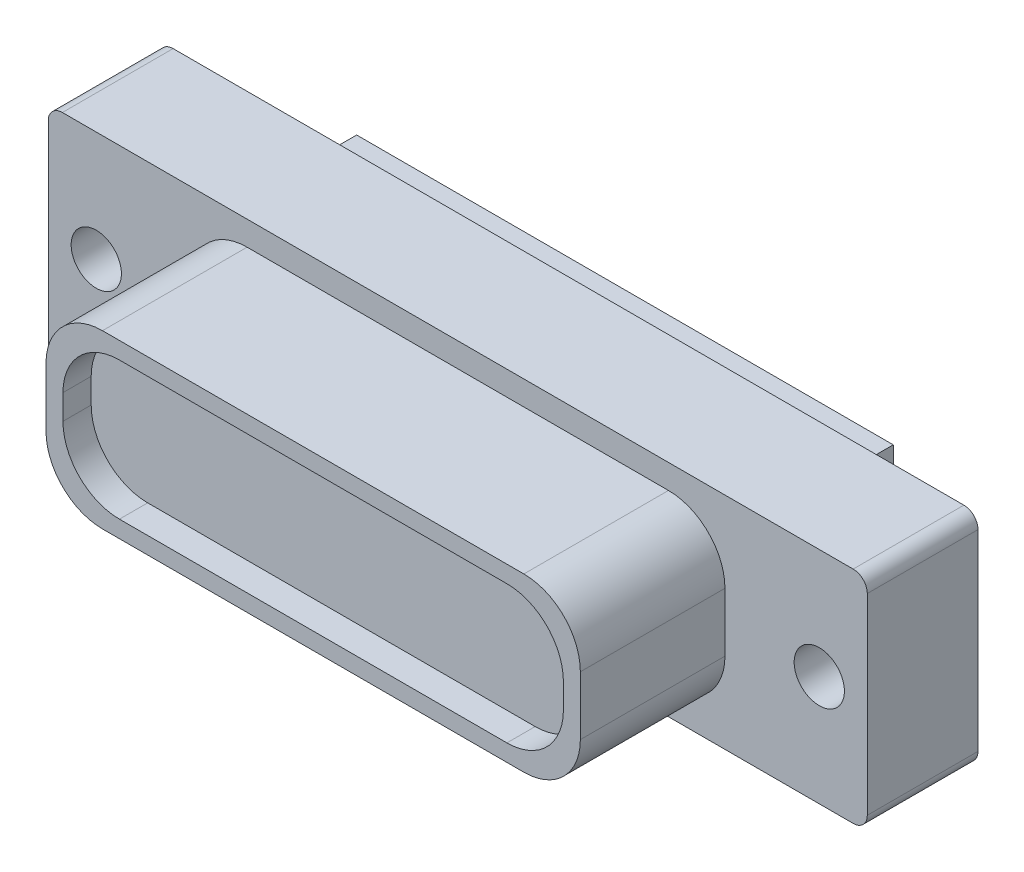
ISO-10303-21;
HEADER;
FILE_DESCRIPTION(('STEP AP214'),'2;1');
FILE_NAME('part.step','',(''),(''),'','','');
FILE_SCHEMA(('AUTOMOTIVE_DESIGN { 1 0 10303 214 1 1 1 1 }'));
ENDSEC;
DATA;
#1=APPLICATION_CONTEXT('core data for automotive mechanical design processes');
#2=APPLICATION_PROTOCOL_DEFINITION('international standard','automotive_design',2000,#1);
#3=PRODUCT_CONTEXT('',#1,'mechanical');
#4=PRODUCT('Part','Part','',(#3));
#5=PRODUCT_RELATED_PRODUCT_CATEGORY('part','',(#4));
#6=PRODUCT_DEFINITION_FORMATION('','',#4);
#7=PRODUCT_DEFINITION_CONTEXT('part definition',#1,'design');
#8=PRODUCT_DEFINITION('design','',#6,#7);
#9=PRODUCT_DEFINITION_SHAPE('','',#8);
#10=(LENGTH_UNIT() NAMED_UNIT(*) SI_UNIT(.MILLI.,.METRE.));
#11=(NAMED_UNIT(*) PLANE_ANGLE_UNIT() SI_UNIT($,.RADIAN.));
#12=(NAMED_UNIT(*) SI_UNIT($,.STERADIAN.) SOLID_ANGLE_UNIT());
#13=UNCERTAINTY_MEASURE_WITH_UNIT(LENGTH_MEASURE(1.E-05),#10,'distance_accuracy_value','');
#14=(GEOMETRIC_REPRESENTATION_CONTEXT(3) GLOBAL_UNCERTAINTY_ASSIGNED_CONTEXT((#13)) GLOBAL_UNIT_ASSIGNED_CONTEXT((#10,
#11,#12)) REPRESENTATION_CONTEXT('',''));
#15=CARTESIAN_POINT('',(0.,0.,0.));
#16=DIRECTION('',(0.,0.,1.));
#17=DIRECTION('',(1.,0.,0.));
#18=AXIS2_PLACEMENT_3D('',#15,#16,#17);
#19=CARTESIAN_POINT('',(0.,0.,0.));
#20=DIRECTION('',(0.,0.,-1.));
#21=DIRECTION('',(-1.,0.,0.));
#22=AXIS2_PLACEMENT_3D('',#19,#20,#21);
#23=PLANE('',#22);
#24=DIRECTION('',(1.,0.,0.));
#25=VECTOR('',#24,1.);
#26=CARTESIAN_POINT('',(-18.415,-4.95300000000001,0.));
#27=LINE('',#26,#25);
#28=CARTESIAN_POINT('',(-17.78,-4.95300000000001,0.));
#29=VERTEX_POINT('',#28);
#30=CARTESIAN_POINT('',(17.78,-4.95300000000001,0.));
#31=VERTEX_POINT('',#30);
#32=EDGE_CURVE('E405',#29,#31,#27,.T.);
#33=ORIENTED_EDGE('',*,*,#32,.F.);
#34=CARTESIAN_POINT('',(-17.78,-4.31800000000001,0.));
#35=DIRECTION('',(0.,0.,-1.));
#36=DIRECTION('',(-1.,0.,0.));
#37=AXIS2_PLACEMENT_3D('',#34,#35,#36);
#38=CIRCLE('',#37,0.635);
#39=CARTESIAN_POINT('',(-18.415,-4.31800000000001,0.));
#40=VERTEX_POINT('',#39);
#41=EDGE_CURVE('E433',#29,#40,#38,.T.);
#42=ORIENTED_EDGE('',*,*,#41,.T.);
#43=DIRECTION('',(0.,-1.,0.));
#44=VECTOR('',#43,1.);
#45=CARTESIAN_POINT('',(-18.415,-4.95300000000001,0.));
#46=LINE('',#45,#44);
#47=CARTESIAN_POINT('',(-18.415,4.31799999999999,0.));
#48=VERTEX_POINT('',#47);
#49=EDGE_CURVE('E418',#48,#40,#46,.T.);
#50=ORIENTED_EDGE('',*,*,#49,.F.);
#51=CARTESIAN_POINT('',(-17.78,4.31799999999999,0.));
#52=DIRECTION('',(0.,0.,-1.));
#53=DIRECTION('',(-1.,0.,0.));
#54=AXIS2_PLACEMENT_3D('',#51,#52,#53);
#55=CIRCLE('',#54,0.635);
#56=CARTESIAN_POINT('',(-17.78,4.95299999999999,0.));
#57=VERTEX_POINT('',#56);
#58=EDGE_CURVE('E427',#48,#57,#55,.T.);
#59=ORIENTED_EDGE('',*,*,#58,.T.);
#60=DIRECTION('',(-1.,0.,0.));
#61=VECTOR('',#60,1.);
#62=CARTESIAN_POINT('',(-18.415,4.95299999999999,0.));
#63=LINE('',#62,#61);
#64=CARTESIAN_POINT('',(17.78,4.95299999999999,0.));
#65=VERTEX_POINT('',#64);
#66=EDGE_CURVE('E416',#65,#57,#63,.T.);
#67=ORIENTED_EDGE('',*,*,#66,.F.);
#68=CARTESIAN_POINT('',(17.78,4.31799999999999,0.));
#69=DIRECTION('',(0.,0.,-1.));
#70=DIRECTION('',(-1.,0.,0.));
#71=AXIS2_PLACEMENT_3D('',#68,#69,#70);
#72=CIRCLE('',#71,0.635);
#73=CARTESIAN_POINT('',(18.415,4.31799999999999,0.));
#74=VERTEX_POINT('',#73);
#75=EDGE_CURVE('E429',#65,#74,#72,.T.);
#76=ORIENTED_EDGE('',*,*,#75,.T.);
#77=DIRECTION('',(0.,1.,0.));
#78=VECTOR('',#77,1.);
#79=CARTESIAN_POINT('',(18.415,-4.95300000000001,0.));
#80=LINE('',#79,#78);
#81=CARTESIAN_POINT('',(18.415,-4.31800000000001,0.));
#82=VERTEX_POINT('',#81);
#83=EDGE_CURVE('E401',#82,#74,#80,.T.);
#84=ORIENTED_EDGE('',*,*,#83,.F.);
#85=CARTESIAN_POINT('',(17.78,-4.31800000000001,0.));
#86=DIRECTION('',(0.,0.,-1.));
#87=DIRECTION('',(-1.,0.,0.));
#88=AXIS2_PLACEMENT_3D('',#85,#86,#87);
#89=CIRCLE('',#88,0.635);
#90=EDGE_CURVE('E431',#82,#31,#89,.T.);
#91=ORIENTED_EDGE('',*,*,#90,.T.);
#92=EDGE_LOOP('',(#33,#42,#50,#59,#67,#76,#84,#91));
#93=FACE_BOUND('',#92,.T.);
#94=CARTESIAN_POINT('',(16.256,0.,0.));
#95=DIRECTION('',(0.,0.,-1.));
#96=DIRECTION('',(-1.,0.,0.));
#97=AXIS2_PLACEMENT_3D('',#94,#95,#96);
#98=CIRCLE('',#97,1.1303);
#99=CARTESIAN_POINT('',(15.1257,0.,0.));
#100=VERTEX_POINT('',#99);
#101=EDGE_CURVE('E333',#100,#100,#98,.T.);
#102=ORIENTED_EDGE('',*,*,#101,.F.);
#103=EDGE_LOOP('',(#102));
#104=FACE_BOUND('',#103,.T.);
#105=CARTESIAN_POINT('',(-16.256,0.,0.));
#106=DIRECTION('',(0.,0.,-1.));
#107=DIRECTION('',(-1.,0.,0.));
#108=AXIS2_PLACEMENT_3D('',#105,#106,#107);
#109=CIRCLE('',#108,1.1303);
#110=CARTESIAN_POINT('',(-17.3863,0.,0.));
#111=VERTEX_POINT('',#110);
#112=EDGE_CURVE('E327',#111,#111,#109,.T.);
#113=ORIENTED_EDGE('',*,*,#112,.F.);
#114=EDGE_LOOP('',(#113));
#115=FACE_BOUND('',#114,.T.);
#116=DIRECTION('',(1.,0.,0.));
#117=VECTOR('',#116,1.);
#118=CARTESIAN_POINT('',(12.065,3.175,0.));
#119=LINE('',#118,#117);
#120=CARTESIAN_POINT('',(-12.065,3.175,0.));
#121=VERTEX_POINT('',#120);
#122=CARTESIAN_POINT('',(12.065,3.175,0.));
#123=VERTEX_POINT('',#122);
#124=EDGE_CURVE('E309',#121,#123,#119,.T.);
#125=ORIENTED_EDGE('',*,*,#124,.F.);
#126=DIRECTION('',(0.,1.,0.));
#127=VECTOR('',#126,1.);
#128=CARTESIAN_POINT('',(-12.065,-3.175,0.));
#129=LINE('',#128,#127);
#130=CARTESIAN_POINT('',(-12.065,-3.175,0.));
#131=VERTEX_POINT('',#130);
#132=EDGE_CURVE('E284',#131,#121,#129,.T.);
#133=ORIENTED_EDGE('',*,*,#132,.F.);
#134=DIRECTION('',(-1.,0.,0.));
#135=VECTOR('',#134,1.);
#136=CARTESIAN_POINT('',(12.065,-3.175,0.));
#137=LINE('',#136,#135);
#138=CARTESIAN_POINT('',(12.065,-3.175,0.));
#139=VERTEX_POINT('',#138);
#140=EDGE_CURVE('E300',#139,#131,#137,.T.);
#141=ORIENTED_EDGE('',*,*,#140,.F.);
#142=DIRECTION('',(0.,-1.,0.));
#143=VECTOR('',#142,1.);
#144=CARTESIAN_POINT('',(12.065,-3.175,0.));
#145=LINE('',#144,#143);
#146=EDGE_CURVE('E311',#123,#139,#145,.T.);
#147=ORIENTED_EDGE('',*,*,#146,.F.);
#148=EDGE_LOOP('',(#125,#133,#141,#147));
#149=FACE_BOUND('',#148,.T.);
#150=ADVANCED_FACE('F35',(#93,#104,#115,#149),#23,.T.);
#151=CARTESIAN_POINT('',(0.,0.,4.9784));
#152=DIRECTION('',(0.,0.,-1.));
#153=DIRECTION('',(-1.,0.,0.));
#154=AXIS2_PLACEMENT_3D('',#151,#152,#153);
#155=PLANE('',#154);
#156=CARTESIAN_POINT('',(-16.256,0.,4.9784));
#157=DIRECTION('',(0.,0.,1.));
#158=DIRECTION('',(1.,0.,0.));
#159=AXIS2_PLACEMENT_3D('',#156,#157,#158);
#160=CIRCLE('',#159,1.1303);
#161=CARTESIAN_POINT('',(-15.1257,0.,4.9784));
#162=VERTEX_POINT('',#161);
#163=EDGE_CURVE('E324',#162,#162,#160,.T.);
#164=ORIENTED_EDGE('',*,*,#163,.F.);
#165=EDGE_LOOP('',(#164));
#166=FACE_BOUND('',#165,.T.);
#167=CARTESIAN_POINT('',(9.4742,1.3208,4.9784));
#168=DIRECTION('',(0.,0.,1.));
#169=DIRECTION('',(1.,0.,0.));
#170=AXIS2_PLACEMENT_3D('',#167,#168,#169);
#171=CIRCLE('',#170,2.54);
#172=CARTESIAN_POINT('',(12.0142,1.32079999999998,4.9784));
#173=VERTEX_POINT('',#172);
#174=CARTESIAN_POINT('',(9.47419999999998,3.8608,4.9784));
#175=VERTEX_POINT('',#174);
#176=EDGE_CURVE('E336',#173,#175,#171,.T.);
#177=ORIENTED_EDGE('',*,*,#176,.F.);
#178=DIRECTION('',(0.,1.,0.));
#179=VECTOR('',#178,1.);
#180=CARTESIAN_POINT('',(12.0142,-1.32079999999998,4.9784));
#181=LINE('',#180,#179);
#182=CARTESIAN_POINT('',(12.0142,-1.32079999999998,4.9784));
#183=VERTEX_POINT('',#182);
#184=EDGE_CURVE('E341',#183,#173,#181,.T.);
#185=ORIENTED_EDGE('',*,*,#184,.F.);
#186=CARTESIAN_POINT('',(9.4742,-1.3208,4.9784));
#187=DIRECTION('',(0.,0.,1.));
#188=DIRECTION('',(1.,0.,0.));
#189=AXIS2_PLACEMENT_3D('',#186,#187,#188);
#190=CIRCLE('',#189,2.54);
#191=CARTESIAN_POINT('',(9.47419999999998,-3.8608,4.9784));
#192=VERTEX_POINT('',#191);
#193=EDGE_CURVE('E373',#192,#183,#190,.T.);
#194=ORIENTED_EDGE('',*,*,#193,.F.);
#195=DIRECTION('',(1.,0.,0.));
#196=VECTOR('',#195,1.);
#197=CARTESIAN_POINT('',(-9.47419999999998,-3.8608,4.9784));
#198=LINE('',#197,#196);
#199=CARTESIAN_POINT('',(-9.47419999999998,-3.8608,4.9784));
#200=VERTEX_POINT('',#199);
#201=EDGE_CURVE('E370',#200,#192,#198,.T.);
#202=ORIENTED_EDGE('',*,*,#201,.F.);
#203=CARTESIAN_POINT('',(-9.4742,-1.3208,4.9784));
#204=DIRECTION('',(0.,0.,1.));
#205=DIRECTION('',(-1.,0.,0.));
#206=AXIS2_PLACEMENT_3D('',#203,#204,#205);
#207=CIRCLE('',#206,2.54);
#208=CARTESIAN_POINT('',(-12.0142,-1.3208,4.9784));
#209=VERTEX_POINT('',#208);
#210=EDGE_CURVE('E367',#209,#200,#207,.T.);
#211=ORIENTED_EDGE('',*,*,#210,.F.);
#212=DIRECTION('',(0.,-1.,0.));
#213=VECTOR('',#212,1.);
#214=CARTESIAN_POINT('',(-12.0142,-1.32079999999998,4.9784));
#215=LINE('',#214,#213);
#216=CARTESIAN_POINT('',(-12.0142,1.32079999999998,4.9784));
#217=VERTEX_POINT('',#216);
#218=EDGE_CURVE('E364',#217,#209,#215,.T.);
#219=ORIENTED_EDGE('',*,*,#218,.F.);
#220=CARTESIAN_POINT('',(-9.4742,1.3208,4.9784));
#221=DIRECTION('',(0.,0.,1.));
#222=DIRECTION('',(1.,0.,0.));
#223=AXIS2_PLACEMENT_3D('',#220,#221,#222);
#224=CIRCLE('',#223,2.54);
#225=CARTESIAN_POINT('',(-9.47419999999998,3.8608,4.9784));
#226=VERTEX_POINT('',#225);
#227=EDGE_CURVE('E361',#226,#217,#224,.T.);
#228=ORIENTED_EDGE('',*,*,#227,.F.);
#229=DIRECTION('',(-1.,0.,0.));
#230=VECTOR('',#229,1.);
#231=CARTESIAN_POINT('',(-9.47419999999998,3.8608,4.9784));
#232=LINE('',#231,#230);
#233=EDGE_CURVE('E358',#175,#226,#232,.T.);
#234=ORIENTED_EDGE('',*,*,#233,.F.);
#235=EDGE_LOOP('',(#177,#185,#194,#202,#211,#219,#228,#234));
#236=FACE_BOUND('',#235,.T.);
#237=DIRECTION('',(0.,-1.,0.));
#238=VECTOR('',#237,1.);
#239=CARTESIAN_POINT('',(-18.415,-4.95300000000001,4.9784));
#240=LINE('',#239,#238);
#241=CARTESIAN_POINT('',(-18.415,4.31799999999999,4.9784));
#242=VERTEX_POINT('',#241);
#243=CARTESIAN_POINT('',(-18.415,-4.31800000000001,4.9784));
#244=VERTEX_POINT('',#243);
#245=EDGE_CURVE('E407',#242,#244,#240,.T.);
#246=ORIENTED_EDGE('',*,*,#245,.T.);
#247=CARTESIAN_POINT('',(-17.78,-4.31800000000001,4.9784));
#248=DIRECTION('',(0.,0.,-1.));
#249=DIRECTION('',(-1.,0.,0.));
#250=AXIS2_PLACEMENT_3D('',#247,#248,#249);
#251=CIRCLE('',#250,0.635);
#252=CARTESIAN_POINT('',(-17.78,-4.95300000000001,4.9784));
#253=VERTEX_POINT('',#252);
#254=EDGE_CURVE('E445',#244,#253,#251,.F.);
#255=ORIENTED_EDGE('',*,*,#254,.T.);
#256=DIRECTION('',(1.,0.,0.));
#257=VECTOR('',#256,1.);
#258=CARTESIAN_POINT('',(-18.415,-4.95300000000001,4.9784));
#259=LINE('',#258,#257);
#260=CARTESIAN_POINT('',(17.78,-4.95300000000001,4.9784));
#261=VERTEX_POINT('',#260);
#262=EDGE_CURVE('E410',#253,#261,#259,.T.);
#263=ORIENTED_EDGE('',*,*,#262,.T.);
#264=CARTESIAN_POINT('',(17.78,-4.31800000000001,4.9784));
#265=DIRECTION('',(0.,0.,-1.));
#266=DIRECTION('',(-1.,0.,0.));
#267=AXIS2_PLACEMENT_3D('',#264,#265,#266);
#268=CIRCLE('',#267,0.635);
#269=CARTESIAN_POINT('',(18.415,-4.31800000000001,4.9784));
#270=VERTEX_POINT('',#269);
#271=EDGE_CURVE('E443',#261,#270,#268,.F.);
#272=ORIENTED_EDGE('',*,*,#271,.T.);
#273=DIRECTION('',(0.,1.,0.));
#274=VECTOR('',#273,1.);
#275=CARTESIAN_POINT('',(18.415,-4.95300000000001,4.9784));
#276=LINE('',#275,#274);
#277=CARTESIAN_POINT('',(18.415,4.31799999999999,4.9784));
#278=VERTEX_POINT('',#277);
#279=EDGE_CURVE('E402',#270,#278,#276,.T.);
#280=ORIENTED_EDGE('',*,*,#279,.T.);
#281=CARTESIAN_POINT('',(17.78,4.31799999999999,4.9784));
#282=DIRECTION('',(0.,0.,-1.));
#283=DIRECTION('',(-1.,0.,0.));
#284=AXIS2_PLACEMENT_3D('',#281,#282,#283);
#285=CIRCLE('',#284,0.635);
#286=CARTESIAN_POINT('',(17.78,4.95299999999999,4.9784));
#287=VERTEX_POINT('',#286);
#288=EDGE_CURVE('E56',#278,#287,#285,.F.);
#289=ORIENTED_EDGE('',*,*,#288,.T.);
#290=DIRECTION('',(-1.,0.,0.));
#291=VECTOR('',#290,1.);
#292=CARTESIAN_POINT('',(-18.415,4.95299999999999,4.9784));
#293=LINE('',#292,#291);
#294=CARTESIAN_POINT('',(-17.78,4.95299999999999,4.9784));
#295=VERTEX_POINT('',#294);
#296=EDGE_CURVE('E404',#287,#295,#293,.T.);
#297=ORIENTED_EDGE('',*,*,#296,.T.);
#298=CARTESIAN_POINT('',(-17.78,4.31799999999999,4.9784));
#299=DIRECTION('',(0.,0.,-1.));
#300=DIRECTION('',(-1.,0.,0.));
#301=AXIS2_PLACEMENT_3D('',#298,#299,#300);
#302=CIRCLE('',#301,0.635);
#303=EDGE_CURVE('E440',#295,#242,#302,.F.);
#304=ORIENTED_EDGE('',*,*,#303,.T.);
#305=EDGE_LOOP('',(#246,#255,#263,#272,#280,#289,#297,#304));
#306=FACE_BOUND('',#305,.T.);
#307=CARTESIAN_POINT('',(16.256,0.,4.9784));
#308=DIRECTION('',(0.,0.,1.));
#309=DIRECTION('',(1.,0.,0.));
#310=AXIS2_PLACEMENT_3D('',#307,#308,#309);
#311=CIRCLE('',#310,1.1303);
#312=CARTESIAN_POINT('',(17.3863,0.,4.9784));
#313=VERTEX_POINT('',#312);
#314=EDGE_CURVE('E330',#313,#313,#311,.T.);
#315=ORIENTED_EDGE('',*,*,#314,.F.);
#316=EDGE_LOOP('',(#315));
#317=FACE_BOUND('',#316,.T.);
#318=ADVANCED_FACE('F468',(#166,#236,#306,#317),#155,.F.);
#319=CARTESIAN_POINT('',(18.415,-4.95300000000001,4.9784));
#320=DIRECTION('',(-1.,0.,0.));
#321=DIRECTION('',(0.,0.,1.));
#322=AXIS2_PLACEMENT_3D('',#319,#320,#321);
#323=PLANE('',#322);
#324=ORIENTED_EDGE('',*,*,#279,.F.);
#325=DIRECTION('',(0.,0.,-1.));
#326=VECTOR('',#325,1.);
#327=CARTESIAN_POINT('',(18.415,-4.31800000000001,4.9784));
#328=LINE('',#327,#326);
#329=EDGE_CURVE('E449',#270,#82,#328,.T.);
#330=ORIENTED_EDGE('',*,*,#329,.T.);
#331=ORIENTED_EDGE('',*,*,#83,.T.);
#332=DIRECTION('',(0.,0.,-1.));
#333=VECTOR('',#332,1.);
#334=CARTESIAN_POINT('',(18.415,4.31799999999999,4.9784));
#335=LINE('',#334,#333);
#336=EDGE_CURVE('E447',#74,#278,#335,.F.);
#337=ORIENTED_EDGE('',*,*,#336,.T.);
#338=EDGE_LOOP('',(#324,#330,#331,#337));
#339=FACE_BOUND('',#338,.T.);
#340=ADVANCED_FACE('F455',(#339),#323,.F.);
#341=CARTESIAN_POINT('',(-18.415,4.95299999999999,4.9784));
#342=DIRECTION('',(0.,-1.,0.));
#343=DIRECTION('',(0.,0.,-1.));
#344=AXIS2_PLACEMENT_3D('',#341,#342,#343);
#345=PLANE('',#344);
#346=ORIENTED_EDGE('',*,*,#296,.F.);
#347=DIRECTION('',(0.,0.,-1.));
#348=VECTOR('',#347,1.);
#349=CARTESIAN_POINT('',(17.78,4.95299999999999,4.9784));
#350=LINE('',#349,#348);
#351=EDGE_CURVE('E11',#287,#65,#350,.T.);
#352=ORIENTED_EDGE('',*,*,#351,.T.);
#353=ORIENTED_EDGE('',*,*,#66,.T.);
#354=DIRECTION('',(0.,0.,-1.));
#355=VECTOR('',#354,1.);
#356=CARTESIAN_POINT('',(-17.78,4.95299999999999,4.9784));
#357=LINE('',#356,#355);
#358=EDGE_CURVE('E43',#57,#295,#357,.F.);
#359=ORIENTED_EDGE('',*,*,#358,.T.);
#360=EDGE_LOOP('',(#346,#352,#353,#359));
#361=FACE_BOUND('',#360,.T.);
#362=ADVANCED_FACE('F466',(#361),#345,.F.);
#363=CARTESIAN_POINT('',(-18.415,-4.95300000000001,4.9784));
#364=DIRECTION('',(1.,0.,0.));
#365=DIRECTION('',(0.,0.,-1.));
#366=AXIS2_PLACEMENT_3D('',#363,#364,#365);
#367=PLANE('',#366);
#368=ORIENTED_EDGE('',*,*,#49,.T.);
#369=DIRECTION('',(0.,0.,-1.));
#370=VECTOR('',#369,1.);
#371=CARTESIAN_POINT('',(-18.415,-4.31800000000001,4.9784));
#372=LINE('',#371,#370);
#373=EDGE_CURVE('E438',#40,#244,#372,.F.);
#374=ORIENTED_EDGE('',*,*,#373,.T.);
#375=ORIENTED_EDGE('',*,*,#245,.F.);
#376=DIRECTION('',(0.,0.,-1.));
#377=VECTOR('',#376,1.);
#378=CARTESIAN_POINT('',(-18.415,4.31799999999999,4.9784));
#379=LINE('',#378,#377);
#380=EDGE_CURVE('E435',#242,#48,#379,.T.);
#381=ORIENTED_EDGE('',*,*,#380,.T.);
#382=EDGE_LOOP('',(#368,#374,#375,#381));
#383=FACE_BOUND('',#382,.T.);
#384=ADVANCED_FACE('F475',(#383),#367,.F.);
#385=CARTESIAN_POINT('',(-18.415,-4.95300000000001,4.9784));
#386=DIRECTION('',(0.,1.,0.));
#387=DIRECTION('',(0.,0.,1.));
#388=AXIS2_PLACEMENT_3D('',#385,#386,#387);
#389=PLANE('',#388);
#390=ORIENTED_EDGE('',*,*,#262,.F.);
#391=DIRECTION('',(0.,0.,-1.));
#392=VECTOR('',#391,1.);
#393=CARTESIAN_POINT('',(-17.78,-4.95300000000001,4.9784));
#394=LINE('',#393,#392);
#395=EDGE_CURVE('E424',#253,#29,#394,.T.);
#396=ORIENTED_EDGE('',*,*,#395,.T.);
#397=ORIENTED_EDGE('',*,*,#32,.T.);
#398=DIRECTION('',(0.,0.,-1.));
#399=VECTOR('',#398,1.);
#400=CARTESIAN_POINT('',(17.78,-4.95300000000001,4.9784));
#401=LINE('',#400,#399);
#402=EDGE_CURVE('E413',#31,#261,#401,.F.);
#403=ORIENTED_EDGE('',*,*,#402,.T.);
#404=EDGE_LOOP('',(#390,#396,#397,#403));
#405=FACE_BOUND('',#404,.T.);
#406=ADVANCED_FACE('F483',(#405),#389,.F.);
#407=CARTESIAN_POINT('',(9.4742,1.3208,11.4808));
#408=DIRECTION('',(0.,0.,-1.));
#409=DIRECTION('',(-1.,0.,0.));
#410=AXIS2_PLACEMENT_3D('',#407,#408,#409);
#411=CYLINDRICAL_SURFACE('',#410,2.54);
#412=ORIENTED_EDGE('',*,*,#176,.T.);
#413=DIRECTION('',(0.,0.,-1.));
#414=VECTOR('',#413,1.);
#415=CARTESIAN_POINT('',(9.47419999999998,3.8608,11.4808));
#416=LINE('',#415,#414);
#417=CARTESIAN_POINT('',(9.47419999999998,3.8608,11.4808));
#418=VERTEX_POINT('',#417);
#419=EDGE_CURVE('E398',#418,#175,#416,.T.);
#420=ORIENTED_EDGE('',*,*,#419,.F.);
#421=CARTESIAN_POINT('',(9.4742,1.3208,11.4808));
#422=DIRECTION('',(0.,0.,1.));
#423=DIRECTION('',(1.,0.,0.));
#424=AXIS2_PLACEMENT_3D('',#421,#422,#423);
#425=CIRCLE('',#424,2.54);
#426=CARTESIAN_POINT('',(12.0142,1.32079999999998,11.4808));
#427=VERTEX_POINT('',#426);
#428=EDGE_CURVE('E337',#427,#418,#425,.T.);
#429=ORIENTED_EDGE('',*,*,#428,.F.);
#430=DIRECTION('',(0.,0.,-1.));
#431=VECTOR('',#430,1.);
#432=CARTESIAN_POINT('',(12.0142,1.32079999999998,11.4808));
#433=LINE('',#432,#431);
#434=EDGE_CURVE('E355',#427,#173,#433,.T.);
#435=ORIENTED_EDGE('',*,*,#434,.T.);
#436=EDGE_LOOP('',(#412,#420,#429,#435));
#437=FACE_BOUND('',#436,.T.);
#438=ADVANCED_FACE('F505',(#437),#411,.T.);
#439=CARTESIAN_POINT('',(-9.47419999999998,3.8608,11.4808));
#440=DIRECTION('',(0.,-1.,0.));
#441=DIRECTION('',(0.,0.,-1.));
#442=AXIS2_PLACEMENT_3D('',#439,#440,#441);
#443=PLANE('',#442);
#444=ORIENTED_EDGE('',*,*,#233,.T.);
#445=DIRECTION('',(0.,0.,-1.));
#446=VECTOR('',#445,1.);
#447=CARTESIAN_POINT('',(-9.47419999999998,3.8608,11.4808));
#448=LINE('',#447,#446);
#449=CARTESIAN_POINT('',(-9.47419999999998,3.8608,11.4808));
#450=VERTEX_POINT('',#449);
#451=EDGE_CURVE('E395',#450,#226,#448,.T.);
#452=ORIENTED_EDGE('',*,*,#451,.F.);
#453=DIRECTION('',(-1.,0.,0.));
#454=VECTOR('',#453,1.);
#455=CARTESIAN_POINT('',(-9.47419999999998,3.8608,11.4808));
#456=LINE('',#455,#454);
#457=EDGE_CURVE('E340',#418,#450,#456,.T.);
#458=ORIENTED_EDGE('',*,*,#457,.F.);
#459=ORIENTED_EDGE('',*,*,#419,.T.);
#460=EDGE_LOOP('',(#444,#452,#458,#459));
#461=FACE_BOUND('',#460,.T.);
#462=ADVANCED_FACE('F727',(#461),#443,.F.);
#463=CARTESIAN_POINT('',(-9.4742,1.3208,11.4808));
#464=DIRECTION('',(0.,0.,-1.));
#465=DIRECTION('',(-1.,0.,0.));
#466=AXIS2_PLACEMENT_3D('',#463,#464,#465);
#467=CYLINDRICAL_SURFACE('',#466,2.54);
#468=ORIENTED_EDGE('',*,*,#227,.T.);
#469=DIRECTION('',(0.,0.,-1.));
#470=VECTOR('',#469,1.);
#471=CARTESIAN_POINT('',(-12.0142,1.32079999999998,11.4808));
#472=LINE('',#471,#470);
#473=CARTESIAN_POINT('',(-12.0142,1.32079999999998,11.4808));
#474=VERTEX_POINT('',#473);
#475=EDGE_CURVE('E392',#474,#217,#472,.T.);
#476=ORIENTED_EDGE('',*,*,#475,.F.);
#477=CARTESIAN_POINT('',(-9.4742,1.3208,11.4808));
#478=DIRECTION('',(0.,0.,1.));
#479=DIRECTION('',(1.,0.,0.));
#480=AXIS2_PLACEMENT_3D('',#477,#478,#479);
#481=CIRCLE('',#480,2.54);
#482=EDGE_CURVE('E343',#450,#474,#481,.T.);
#483=ORIENTED_EDGE('',*,*,#482,.F.);
#484=ORIENTED_EDGE('',*,*,#451,.T.);
#485=EDGE_LOOP('',(#468,#476,#483,#484));
#486=FACE_BOUND('',#485,.T.);
#487=ADVANCED_FACE('F719',(#486),#467,.T.);
#488=CARTESIAN_POINT('',(-12.0142,-1.32079999999998,11.4808));
#489=DIRECTION('',(1.,0.,0.));
#490=DIRECTION('',(0.,0.,-1.));
#491=AXIS2_PLACEMENT_3D('',#488,#489,#490);
#492=PLANE('',#491);
#493=ORIENTED_EDGE('',*,*,#218,.T.);
#494=DIRECTION('',(0.,0.,-1.));
#495=VECTOR('',#494,1.);
#496=CARTESIAN_POINT('',(-12.0142,-1.32079999999998,11.4808));
#497=LINE('',#496,#495);
#498=CARTESIAN_POINT('',(-12.0142,-1.32079999999998,11.4808));
#499=VERTEX_POINT('',#498);
#500=EDGE_CURVE('E389',#499,#209,#497,.T.);
#501=ORIENTED_EDGE('',*,*,#500,.F.);
#502=DIRECTION('',(0.,-1.,0.));
#503=VECTOR('',#502,1.);
#504=CARTESIAN_POINT('',(-12.0142,-1.32079999999998,11.4808));
#505=LINE('',#504,#503);
#506=EDGE_CURVE('E345',#474,#499,#505,.T.);
#507=ORIENTED_EDGE('',*,*,#506,.F.);
#508=ORIENTED_EDGE('',*,*,#475,.T.);
#509=EDGE_LOOP('',(#493,#501,#507,#508));
#510=FACE_BOUND('',#509,.T.);
#511=ADVANCED_FACE('F711',(#510),#492,.F.);
#512=CARTESIAN_POINT('',(-9.4742,-1.3208,11.4808));
#513=DIRECTION('',(0.,0.,-1.));
#514=DIRECTION('',(-1.,0.,0.));
#515=AXIS2_PLACEMENT_3D('',#512,#513,#514);
#516=CYLINDRICAL_SURFACE('',#515,2.54);
#517=ORIENTED_EDGE('',*,*,#210,.T.);
#518=DIRECTION('',(0.,0.,-1.));
#519=VECTOR('',#518,1.);
#520=CARTESIAN_POINT('',(-9.47419999999998,-3.8608,11.4808));
#521=LINE('',#520,#519);
#522=CARTESIAN_POINT('',(-9.47419999999998,-3.8608,11.4808));
#523=VERTEX_POINT('',#522);
#524=EDGE_CURVE('E386',#523,#200,#521,.T.);
#525=ORIENTED_EDGE('',*,*,#524,.F.);
#526=CARTESIAN_POINT('',(-9.4742,-1.3208,11.4808));
#527=DIRECTION('',(0.,0.,1.));
#528=DIRECTION('',(-1.,0.,0.));
#529=AXIS2_PLACEMENT_3D('',#526,#527,#528);
#530=CIRCLE('',#529,2.54);
#531=EDGE_CURVE('E347',#499,#523,#530,.T.);
#532=ORIENTED_EDGE('',*,*,#531,.F.);
#533=ORIENTED_EDGE('',*,*,#500,.T.);
#534=EDGE_LOOP('',(#517,#525,#532,#533));
#535=FACE_BOUND('',#534,.T.);
#536=ADVANCED_FACE('F703',(#535),#516,.T.);
#537=CARTESIAN_POINT('',(-9.47419999999998,-3.8608,11.4808));
#538=DIRECTION('',(0.,1.,0.));
#539=DIRECTION('',(0.,0.,1.));
#540=AXIS2_PLACEMENT_3D('',#537,#538,#539);
#541=PLANE('',#540);
#542=ORIENTED_EDGE('',*,*,#201,.T.);
#543=DIRECTION('',(0.,0.,-1.));
#544=VECTOR('',#543,1.);
#545=CARTESIAN_POINT('',(9.47419999999998,-3.8608,11.4808));
#546=LINE('',#545,#544);
#547=CARTESIAN_POINT('',(9.47419999999998,-3.8608,11.4808));
#548=VERTEX_POINT('',#547);
#549=EDGE_CURVE('E383',#548,#192,#546,.T.);
#550=ORIENTED_EDGE('',*,*,#549,.F.);
#551=DIRECTION('',(1.,0.,0.));
#552=VECTOR('',#551,1.);
#553=CARTESIAN_POINT('',(-9.47419999999998,-3.8608,11.4808));
#554=LINE('',#553,#552);
#555=EDGE_CURVE('E349',#523,#548,#554,.T.);
#556=ORIENTED_EDGE('',*,*,#555,.F.);
#557=ORIENTED_EDGE('',*,*,#524,.T.);
#558=EDGE_LOOP('',(#542,#550,#556,#557));
#559=FACE_BOUND('',#558,.T.);
#560=ADVANCED_FACE('F695',(#559),#541,.F.);
#561=CARTESIAN_POINT('',(9.4742,-1.3208,11.4808));
#562=DIRECTION('',(0.,0.,-1.));
#563=DIRECTION('',(-1.,0.,0.));
#564=AXIS2_PLACEMENT_3D('',#561,#562,#563);
#565=CYLINDRICAL_SURFACE('',#564,2.54);
#566=ORIENTED_EDGE('',*,*,#193,.T.);
#567=DIRECTION('',(0.,0.,-1.));
#568=VECTOR('',#567,1.);
#569=CARTESIAN_POINT('',(12.0142,-1.32079999999998,11.4808));
#570=LINE('',#569,#568);
#571=CARTESIAN_POINT('',(12.0142,-1.32079999999998,11.4808));
#572=VERTEX_POINT('',#571);
#573=EDGE_CURVE('E380',#572,#183,#570,.T.);
#574=ORIENTED_EDGE('',*,*,#573,.F.);
#575=CARTESIAN_POINT('',(9.4742,-1.3208,11.4808));
#576=DIRECTION('',(0.,0.,1.));
#577=DIRECTION('',(1.,0.,0.));
#578=AXIS2_PLACEMENT_3D('',#575,#576,#577);
#579=CIRCLE('',#578,2.54);
#580=EDGE_CURVE('E351',#548,#572,#579,.T.);
#581=ORIENTED_EDGE('',*,*,#580,.F.);
#582=ORIENTED_EDGE('',*,*,#549,.T.);
#583=EDGE_LOOP('',(#566,#574,#581,#582));
#584=FACE_BOUND('',#583,.T.);
#585=ADVANCED_FACE('F687',(#584),#565,.T.);
#586=CARTESIAN_POINT('',(12.0142,-1.32079999999998,11.4808));
#587=DIRECTION('',(-1.,0.,0.));
#588=DIRECTION('',(0.,0.,1.));
#589=AXIS2_PLACEMENT_3D('',#586,#587,#588);
#590=PLANE('',#589);
#591=ORIENTED_EDGE('',*,*,#184,.T.);
#592=ORIENTED_EDGE('',*,*,#434,.F.);
#593=DIRECTION('',(0.,1.,0.));
#594=VECTOR('',#593,1.);
#595=CARTESIAN_POINT('',(12.0142,-1.32079999999998,11.4808));
#596=LINE('',#595,#594);
#597=EDGE_CURVE('E353',#572,#427,#596,.T.);
#598=ORIENTED_EDGE('',*,*,#597,.F.);
#599=ORIENTED_EDGE('',*,*,#573,.T.);
#600=EDGE_LOOP('',(#591,#592,#598,#599));
#601=FACE_BOUND('',#600,.T.);
#602=ADVANCED_FACE('F679',(#601),#590,.F.);
#603=CARTESIAN_POINT('',(9.4742,1.3208,11.4808));
#604=DIRECTION('',(0.,0.,1.));
#605=DIRECTION('',(1.,0.,0.));
#606=AXIS2_PLACEMENT_3D('',#603,#604,#605);
#607=PLANE('',#606);
#608=CARTESIAN_POINT('',(-8.7122,-0.5588,11.4808));
#609=DIRECTION('',(0.,0.,1.));
#610=DIRECTION('',(-1.,0.,0.));
#611=AXIS2_PLACEMENT_3D('',#608,#609,#610);
#612=CIRCLE('',#611,2.54);
#613=CARTESIAN_POINT('',(-11.2522,-0.558799999999982,11.4808));
#614=VERTEX_POINT('',#613);
#615=CARTESIAN_POINT('',(-8.71219999999998,-3.0988,11.4808));
#616=VERTEX_POINT('',#615);
#617=EDGE_CURVE('E228',#614,#616,#612,.T.);
#618=ORIENTED_EDGE('',*,*,#617,.F.);
#619=DIRECTION('',(0.,-1.,0.));
#620=VECTOR('',#619,1.);
#621=CARTESIAN_POINT('',(-11.2522,-0.558799999999982,11.4808));
#622=LINE('',#621,#620);
#623=CARTESIAN_POINT('',(-11.2522,0.558799999999982,11.4808));
#624=VERTEX_POINT('',#623);
#625=EDGE_CURVE('E246',#624,#614,#622,.T.);
#626=ORIENTED_EDGE('',*,*,#625,.F.);
#627=CARTESIAN_POINT('',(-8.7122,0.5588,11.4808));
#628=DIRECTION('',(0.,0.,1.));
#629=DIRECTION('',(1.,0.,0.));
#630=AXIS2_PLACEMENT_3D('',#627,#628,#629);
#631=CIRCLE('',#630,2.54);
#632=CARTESIAN_POINT('',(-8.71219999999998,3.0988,11.4808));
#633=VERTEX_POINT('',#632);
#634=EDGE_CURVE('E249',#633,#624,#631,.T.);
#635=ORIENTED_EDGE('',*,*,#634,.F.);
#636=DIRECTION('',(-1.,0.,0.));
#637=VECTOR('',#636,1.);
#638=CARTESIAN_POINT('',(-8.71219999999998,3.0988,11.4808));
#639=LINE('',#638,#637);
#640=CARTESIAN_POINT('',(8.71219999999998,3.0988,11.4808));
#641=VERTEX_POINT('',#640);
#642=EDGE_CURVE('E277',#641,#633,#639,.T.);
#643=ORIENTED_EDGE('',*,*,#642,.F.);
#644=CARTESIAN_POINT('',(8.7122,0.5588,11.4808));
#645=DIRECTION('',(0.,0.,1.));
#646=DIRECTION('',(1.,0.,0.));
#647=AXIS2_PLACEMENT_3D('',#644,#645,#646);
#648=CIRCLE('',#647,2.54);
#649=CARTESIAN_POINT('',(11.2522,0.558799999999982,11.4808));
#650=VERTEX_POINT('',#649);
#651=EDGE_CURVE('E274',#650,#641,#648,.T.);
#652=ORIENTED_EDGE('',*,*,#651,.F.);
#653=DIRECTION('',(0.,1.,0.));
#654=VECTOR('',#653,1.);
#655=CARTESIAN_POINT('',(11.2522,-0.558799999999982,11.4808));
#656=LINE('',#655,#654);
#657=CARTESIAN_POINT('',(11.2522,-0.558799999999982,11.4808));
#658=VERTEX_POINT('',#657);
#659=EDGE_CURVE('E271',#658,#650,#656,.T.);
#660=ORIENTED_EDGE('',*,*,#659,.F.);
#661=CARTESIAN_POINT('',(8.7122,-0.5588,11.4808));
#662=DIRECTION('',(0.,0.,1.));
#663=DIRECTION('',(1.,0.,0.));
#664=AXIS2_PLACEMENT_3D('',#661,#662,#663);
#665=CIRCLE('',#664,2.54);
#666=CARTESIAN_POINT('',(8.71219999999998,-3.0988,11.4808));
#667=VERTEX_POINT('',#666);
#668=EDGE_CURVE('E268',#667,#658,#665,.T.);
#669=ORIENTED_EDGE('',*,*,#668,.F.);
#670=DIRECTION('',(1.,0.,0.));
#671=VECTOR('',#670,1.);
#672=CARTESIAN_POINT('',(-8.71219999999998,-3.0988,11.4808));
#673=LINE('',#672,#671);
#674=EDGE_CURVE('E266',#616,#667,#673,.T.);
#675=ORIENTED_EDGE('',*,*,#674,.F.);
#676=EDGE_LOOP('',(#618,#626,#635,#643,#652,#660,#669,#675));
#677=FACE_BOUND('',#676,.T.);
#678=ORIENTED_EDGE('',*,*,#428,.T.);
#679=ORIENTED_EDGE('',*,*,#457,.T.);
#680=ORIENTED_EDGE('',*,*,#482,.T.);
#681=ORIENTED_EDGE('',*,*,#506,.T.);
#682=ORIENTED_EDGE('',*,*,#531,.T.);
#683=ORIENTED_EDGE('',*,*,#555,.T.);
#684=ORIENTED_EDGE('',*,*,#580,.T.);
#685=ORIENTED_EDGE('',*,*,#597,.T.);
#686=EDGE_LOOP('',(#678,#679,#680,#681,#682,#683,#684,#685));
#687=FACE_BOUND('',#686,.T.);
#688=ADVANCED_FACE('F672',(#677,#687),#607,.T.);
#689=CARTESIAN_POINT('',(16.256,0.,4.9784));
#690=DIRECTION('',(0.,0.,1.));
#691=DIRECTION('',(1.,0.,0.));
#692=AXIS2_PLACEMENT_3D('',#689,#690,#691);
#693=CYLINDRICAL_SURFACE('',#692,1.1303);
#694=ORIENTED_EDGE('',*,*,#101,.T.);
#695=EDGE_LOOP('',(#694));
#696=FACE_BOUND('',#695,.T.);
#697=ORIENTED_EDGE('',*,*,#314,.T.);
#698=EDGE_LOOP('',(#697));
#699=FACE_BOUND('',#698,.T.);
#700=ADVANCED_FACE('F665',(#696,#699),#693,.F.);
#701=CARTESIAN_POINT('',(-16.256,0.,4.9784));
#702=DIRECTION('',(0.,0.,1.));
#703=DIRECTION('',(1.,0.,0.));
#704=AXIS2_PLACEMENT_3D('',#701,#702,#703);
#705=CYLINDRICAL_SURFACE('',#704,1.1303);
#706=ORIENTED_EDGE('',*,*,#112,.T.);
#707=EDGE_LOOP('',(#706));
#708=FACE_BOUND('',#707,.T.);
#709=ORIENTED_EDGE('',*,*,#163,.T.);
#710=EDGE_LOOP('',(#709));
#711=FACE_BOUND('',#710,.T.);
#712=ADVANCED_FACE('F656',(#708,#711),#705,.F.);
#713=CARTESIAN_POINT('',(-12.065,-3.175,-2.54));
#714=DIRECTION('',(1.,0.,0.));
#715=DIRECTION('',(0.,0.,-1.));
#716=AXIS2_PLACEMENT_3D('',#713,#714,#715);
#717=PLANE('',#716);
#718=ORIENTED_EDGE('',*,*,#132,.T.);
#719=DIRECTION('',(0.,0.,1.));
#720=VECTOR('',#719,1.);
#721=CARTESIAN_POINT('',(-12.065,3.175,-2.54));
#722=LINE('',#721,#720);
#723=CARTESIAN_POINT('',(-12.065,3.175,-2.54));
#724=VERTEX_POINT('',#723);
#725=EDGE_CURVE('E322',#724,#121,#722,.T.);
#726=ORIENTED_EDGE('',*,*,#725,.F.);
#727=DIRECTION('',(0.,1.,0.));
#728=VECTOR('',#727,1.);
#729=CARTESIAN_POINT('',(-12.065,-3.175,-2.54));
#730=LINE('',#729,#728);
#731=CARTESIAN_POINT('',(-12.065,-3.175,-2.54));
#732=VERTEX_POINT('',#731);
#733=EDGE_CURVE('E296',#732,#724,#730,.T.);
#734=ORIENTED_EDGE('',*,*,#733,.F.);
#735=DIRECTION('',(0.,0.,1.));
#736=VECTOR('',#735,1.);
#737=CARTESIAN_POINT('',(-12.065,-3.175,-2.54));
#738=LINE('',#737,#736);
#739=EDGE_CURVE('E306',#732,#131,#738,.T.);
#740=ORIENTED_EDGE('',*,*,#739,.T.);
#741=EDGE_LOOP('',(#718,#726,#734,#740));
#742=FACE_BOUND('',#741,.T.);
#743=ADVANCED_FACE('F648',(#742),#717,.F.);
#744=CARTESIAN_POINT('',(12.065,3.175,-2.54));
#745=DIRECTION('',(0.,-1.,0.));
#746=DIRECTION('',(0.,0.,-1.));
#747=AXIS2_PLACEMENT_3D('',#744,#745,#746);
#748=PLANE('',#747);
#749=ORIENTED_EDGE('',*,*,#124,.T.);
#750=DIRECTION('',(0.,0.,1.));
#751=VECTOR('',#750,1.);
#752=CARTESIAN_POINT('',(12.065,3.175,-2.54));
#753=LINE('',#752,#751);
#754=CARTESIAN_POINT('',(12.065,3.175,-2.54));
#755=VERTEX_POINT('',#754);
#756=EDGE_CURVE('E319',#755,#123,#753,.T.);
#757=ORIENTED_EDGE('',*,*,#756,.F.);
#758=DIRECTION('',(1.,0.,0.));
#759=VECTOR('',#758,1.);
#760=CARTESIAN_POINT('',(12.065,3.175,-2.54));
#761=LINE('',#760,#759);
#762=EDGE_CURVE('E299',#724,#755,#761,.T.);
#763=ORIENTED_EDGE('',*,*,#762,.F.);
#764=ORIENTED_EDGE('',*,*,#725,.T.);
#765=EDGE_LOOP('',(#749,#757,#763,#764));
#766=FACE_BOUND('',#765,.T.);
#767=ADVANCED_FACE('F640',(#766),#748,.F.);
#768=CARTESIAN_POINT('',(12.065,-3.175,-2.54));
#769=DIRECTION('',(-1.,0.,0.));
#770=DIRECTION('',(0.,0.,1.));
#771=AXIS2_PLACEMENT_3D('',#768,#769,#770);
#772=PLANE('',#771);
#773=ORIENTED_EDGE('',*,*,#146,.T.);
#774=DIRECTION('',(0.,0.,1.));
#775=VECTOR('',#774,1.);
#776=CARTESIAN_POINT('',(12.065,-3.175,-2.54));
#777=LINE('',#776,#775);
#778=CARTESIAN_POINT('',(12.065,-3.175,-2.54));
#779=VERTEX_POINT('',#778);
#780=EDGE_CURVE('E317',#779,#139,#777,.T.);
#781=ORIENTED_EDGE('',*,*,#780,.F.);
#782=DIRECTION('',(0.,-1.,0.));
#783=VECTOR('',#782,1.);
#784=CARTESIAN_POINT('',(12.065,-3.175,-2.54));
#785=LINE('',#784,#783);
#786=EDGE_CURVE('E302',#755,#779,#785,.T.);
#787=ORIENTED_EDGE('',*,*,#786,.F.);
#788=ORIENTED_EDGE('',*,*,#756,.T.);
#789=EDGE_LOOP('',(#773,#781,#787,#788));
#790=FACE_BOUND('',#789,.T.);
#791=ADVANCED_FACE('F632',(#790),#772,.F.);
#792=CARTESIAN_POINT('',(12.065,-3.175,-2.54));
#793=DIRECTION('',(0.,1.,0.));
#794=DIRECTION('',(0.,0.,1.));
#795=AXIS2_PLACEMENT_3D('',#792,#793,#794);
#796=PLANE('',#795);
#797=ORIENTED_EDGE('',*,*,#140,.T.);
#798=ORIENTED_EDGE('',*,*,#739,.F.);
#799=DIRECTION('',(-1.,0.,0.));
#800=VECTOR('',#799,1.);
#801=CARTESIAN_POINT('',(12.065,-3.175,-2.54));
#802=LINE('',#801,#800);
#803=EDGE_CURVE('E304',#779,#732,#802,.T.);
#804=ORIENTED_EDGE('',*,*,#803,.F.);
#805=ORIENTED_EDGE('',*,*,#780,.T.);
#806=EDGE_LOOP('',(#797,#798,#804,#805));
#807=FACE_BOUND('',#806,.T.);
#808=ADVANCED_FACE('F624',(#807),#796,.F.);
#809=CARTESIAN_POINT('',(0.,0.,-2.54));
#810=DIRECTION('',(0.,0.,1.));
#811=DIRECTION('',(1.,0.,0.));
#812=AXIS2_PLACEMENT_3D('',#809,#810,#811);
#813=PLANE('',#812);
#814=ORIENTED_EDGE('',*,*,#733,.T.);
#815=ORIENTED_EDGE('',*,*,#762,.T.);
#816=ORIENTED_EDGE('',*,*,#786,.T.);
#817=ORIENTED_EDGE('',*,*,#803,.T.);
#818=EDGE_LOOP('',(#814,#815,#816,#817));
#819=FACE_BOUND('',#818,.T.);
#820=ADVANCED_FACE('F616',(#819),#813,.F.);
#821=CARTESIAN_POINT('',(-8.7122,-0.5588,10.2108));
#822=DIRECTION('',(0.,0.,1.));
#823=DIRECTION('',(1.,0.,0.));
#824=AXIS2_PLACEMENT_3D('',#821,#822,#823);
#825=CYLINDRICAL_SURFACE('',#824,2.54);
#826=ORIENTED_EDGE('',*,*,#617,.T.);
#827=DIRECTION('',(0.,0.,1.));
#828=VECTOR('',#827,1.);
#829=CARTESIAN_POINT('',(-8.71219999999998,-3.0988,10.2108));
#830=LINE('',#829,#828);
#831=CARTESIAN_POINT('',(-8.71219999999998,-3.0988,10.2108));
#832=VERTEX_POINT('',#831);
#833=EDGE_CURVE('E221',#832,#616,#830,.T.);
#834=ORIENTED_EDGE('',*,*,#833,.F.);
#835=CARTESIAN_POINT('',(-8.7122,-0.5588,10.2108));
#836=DIRECTION('',(0.,0.,1.));
#837=DIRECTION('',(-1.,0.,0.));
#838=AXIS2_PLACEMENT_3D('',#835,#836,#837);
#839=CIRCLE('',#838,2.54);
#840=CARTESIAN_POINT('',(-11.2522,-0.558799999999982,10.2108));
#841=VERTEX_POINT('',#840);
#842=EDGE_CURVE('E225',#841,#832,#839,.T.);
#843=ORIENTED_EDGE('',*,*,#842,.F.);
#844=DIRECTION('',(0.,0.,1.));
#845=VECTOR('',#844,1.);
#846=CARTESIAN_POINT('',(-11.2522,-0.558799999999982,10.2108));
#847=LINE('',#846,#845);
#848=EDGE_CURVE('E282',#841,#614,#847,.T.);
#849=ORIENTED_EDGE('',*,*,#848,.T.);
#850=EDGE_LOOP('',(#826,#834,#843,#849));
#851=FACE_BOUND('',#850,.T.);
#852=ADVANCED_FACE('F223',(#851),#825,.F.);
#853=CARTESIAN_POINT('',(-11.2522,-0.558799999999982,10.2108));
#854=DIRECTION('',(-1.,0.,0.));
#855=DIRECTION('',(0.,0.,1.));
#856=AXIS2_PLACEMENT_3D('',#853,#854,#855);
#857=PLANE('',#856);
#858=ORIENTED_EDGE('',*,*,#625,.T.);
#859=ORIENTED_EDGE('',*,*,#848,.F.);
#860=DIRECTION('',(0.,-1.,0.));
#861=VECTOR('',#860,1.);
#862=CARTESIAN_POINT('',(-11.2522,-0.558799999999982,10.2108));
#863=LINE('',#862,#861);
#864=CARTESIAN_POINT('',(-11.2522,0.558799999999982,10.2108));
#865=VERTEX_POINT('',#864);
#866=EDGE_CURVE('E233',#865,#841,#863,.T.);
#867=ORIENTED_EDGE('',*,*,#866,.F.);
#868=DIRECTION('',(0.,0.,1.));
#869=VECTOR('',#868,1.);
#870=CARTESIAN_POINT('',(-11.2522,0.558799999999982,10.2108));
#871=LINE('',#870,#869);
#872=EDGE_CURVE('E285',#865,#624,#871,.T.);
#873=ORIENTED_EDGE('',*,*,#872,.T.);
#874=EDGE_LOOP('',(#858,#859,#867,#873));
#875=FACE_BOUND('',#874,.T.);
#876=ADVANCED_FACE('F601',(#875),#857,.F.);
#877=CARTESIAN_POINT('',(-8.7122,0.5588,10.2108));
#878=DIRECTION('',(0.,0.,1.));
#879=DIRECTION('',(1.,0.,0.));
#880=AXIS2_PLACEMENT_3D('',#877,#878,#879);
#881=CYLINDRICAL_SURFACE('',#880,2.54);
#882=ORIENTED_EDGE('',*,*,#634,.T.);
#883=ORIENTED_EDGE('',*,*,#872,.F.);
#884=CARTESIAN_POINT('',(-8.7122,0.5588,10.2108));
#885=DIRECTION('',(0.,0.,1.));
#886=DIRECTION('',(1.,0.,0.));
#887=AXIS2_PLACEMENT_3D('',#884,#885,#886);
#888=CIRCLE('',#887,2.54);
#889=CARTESIAN_POINT('',(-8.71219999999998,3.0988,10.2108));
#890=VERTEX_POINT('',#889);
#891=EDGE_CURVE('E262',#890,#865,#888,.T.);
#892=ORIENTED_EDGE('',*,*,#891,.F.);
#893=DIRECTION('',(0.,0.,1.));
#894=VECTOR('',#893,1.);
#895=CARTESIAN_POINT('',(-8.71219999999998,3.0988,10.2108));
#896=LINE('',#895,#894);
#897=EDGE_CURVE('E287',#890,#633,#896,.T.);
#898=ORIENTED_EDGE('',*,*,#897,.T.);
#899=EDGE_LOOP('',(#882,#883,#892,#898));
#900=FACE_BOUND('',#899,.T.);
#901=ADVANCED_FACE('F593',(#900),#881,.F.);
#902=CARTESIAN_POINT('',(-8.71219999999998,3.0988,10.2108));
#903=DIRECTION('',(0.,1.,0.));
#904=DIRECTION('',(0.,0.,1.));
#905=AXIS2_PLACEMENT_3D('',#902,#903,#904);
#906=PLANE('',#905);
#907=ORIENTED_EDGE('',*,*,#642,.T.);
#908=ORIENTED_EDGE('',*,*,#897,.F.);
#909=DIRECTION('',(-1.,0.,0.));
#910=VECTOR('',#909,1.);
#911=CARTESIAN_POINT('',(-8.71219999999998,3.0988,10.2108));
#912=LINE('',#911,#910);
#913=CARTESIAN_POINT('',(8.71219999999998,3.0988,10.2108));
#914=VERTEX_POINT('',#913);
#915=EDGE_CURVE('E259',#914,#890,#912,.T.);
#916=ORIENTED_EDGE('',*,*,#915,.F.);
#917=DIRECTION('',(0.,0.,1.));
#918=VECTOR('',#917,1.);
#919=CARTESIAN_POINT('',(8.71219999999998,3.0988,10.2108));
#920=LINE('',#919,#918);
#921=EDGE_CURVE('E289',#914,#641,#920,.T.);
#922=ORIENTED_EDGE('',*,*,#921,.T.);
#923=EDGE_LOOP('',(#907,#908,#916,#922));
#924=FACE_BOUND('',#923,.T.);
#925=ADVANCED_FACE('F585',(#924),#906,.F.);
#926=CARTESIAN_POINT('',(8.7122,0.5588,10.2108));
#927=DIRECTION('',(0.,0.,1.));
#928=DIRECTION('',(1.,0.,0.));
#929=AXIS2_PLACEMENT_3D('',#926,#927,#928);
#930=CYLINDRICAL_SURFACE('',#929,2.54);
#931=ORIENTED_EDGE('',*,*,#651,.T.);
#932=ORIENTED_EDGE('',*,*,#921,.F.);
#933=CARTESIAN_POINT('',(8.7122,0.5588,10.2108));
#934=DIRECTION('',(0.,0.,1.));
#935=DIRECTION('',(1.,0.,0.));
#936=AXIS2_PLACEMENT_3D('',#933,#934,#935);
#937=CIRCLE('',#936,2.54);
#938=CARTESIAN_POINT('',(11.2522,0.558799999999982,10.2108));
#939=VERTEX_POINT('',#938);
#940=EDGE_CURVE('E256',#939,#914,#937,.T.);
#941=ORIENTED_EDGE('',*,*,#940,.F.);
#942=DIRECTION('',(0.,0.,1.));
#943=VECTOR('',#942,1.);
#944=CARTESIAN_POINT('',(11.2522,0.558799999999982,10.2108));
#945=LINE('',#944,#943);
#946=EDGE_CURVE('E291',#939,#650,#945,.T.);
#947=ORIENTED_EDGE('',*,*,#946,.T.);
#948=EDGE_LOOP('',(#931,#932,#941,#947));
#949=FACE_BOUND('',#948,.T.);
#950=ADVANCED_FACE('F577',(#949),#930,.F.);
#951=CARTESIAN_POINT('',(11.2522,-0.558799999999982,10.2108));
#952=DIRECTION('',(1.,0.,0.));
#953=DIRECTION('',(0.,0.,-1.));
#954=AXIS2_PLACEMENT_3D('',#951,#952,#953);
#955=PLANE('',#954);
#956=ORIENTED_EDGE('',*,*,#659,.T.);
#957=ORIENTED_EDGE('',*,*,#946,.F.);
#958=DIRECTION('',(0.,1.,0.));
#959=VECTOR('',#958,1.);
#960=CARTESIAN_POINT('',(11.2522,-0.558799999999982,10.2108));
#961=LINE('',#960,#959);
#962=CARTESIAN_POINT('',(11.2522,-0.558799999999982,10.2108));
#963=VERTEX_POINT('',#962);
#964=EDGE_CURVE('E253',#963,#939,#961,.T.);
#965=ORIENTED_EDGE('',*,*,#964,.F.);
#966=DIRECTION('',(0.,0.,1.));
#967=VECTOR('',#966,1.);
#968=CARTESIAN_POINT('',(11.2522,-0.558799999999982,10.2108));
#969=LINE('',#968,#967);
#970=EDGE_CURVE('E293',#963,#658,#969,.T.);
#971=ORIENTED_EDGE('',*,*,#970,.T.);
#972=EDGE_LOOP('',(#956,#957,#965,#971));
#973=FACE_BOUND('',#972,.T.);
#974=ADVANCED_FACE('F569',(#973),#955,.F.);
#975=CARTESIAN_POINT('',(8.7122,-0.5588,10.2108));
#976=DIRECTION('',(0.,0.,1.));
#977=DIRECTION('',(1.,0.,0.));
#978=AXIS2_PLACEMENT_3D('',#975,#976,#977);
#979=CYLINDRICAL_SURFACE('',#978,2.54);
#980=ORIENTED_EDGE('',*,*,#668,.T.);
#981=ORIENTED_EDGE('',*,*,#970,.F.);
#982=CARTESIAN_POINT('',(8.7122,-0.5588,10.2108));
#983=DIRECTION('',(0.,0.,1.));
#984=DIRECTION('',(1.,0.,0.));
#985=AXIS2_PLACEMENT_3D('',#982,#983,#984);
#986=CIRCLE('',#985,2.54);
#987=CARTESIAN_POINT('',(8.71219999999998,-3.0988,10.2108));
#988=VERTEX_POINT('',#987);
#989=EDGE_CURVE('E241',#988,#963,#986,.T.);
#990=ORIENTED_EDGE('',*,*,#989,.F.);
#991=DIRECTION('',(0.,0.,1.));
#992=VECTOR('',#991,1.);
#993=CARTESIAN_POINT('',(8.71219999999998,-3.0988,10.2108));
#994=LINE('',#993,#992);
#995=EDGE_CURVE('E232',#988,#667,#994,.T.);
#996=ORIENTED_EDGE('',*,*,#995,.T.);
#997=EDGE_LOOP('',(#980,#981,#990,#996));
#998=FACE_BOUND('',#997,.T.);
#999=ADVANCED_FACE('F562',(#998),#979,.F.);
#1000=CARTESIAN_POINT('',(-8.71219999999998,-3.0988,10.2108));
#1001=DIRECTION('',(0.,-1.,0.));
#1002=DIRECTION('',(0.,0.,-1.));
#1003=AXIS2_PLACEMENT_3D('',#1000,#1001,#1002);
#1004=PLANE('',#1003);
#1005=ORIENTED_EDGE('',*,*,#674,.T.);
#1006=ORIENTED_EDGE('',*,*,#995,.F.);
#1007=DIRECTION('',(1.,0.,0.));
#1008=VECTOR('',#1007,1.);
#1009=CARTESIAN_POINT('',(-8.71219999999998,-3.0988,10.2108));
#1010=LINE('',#1009,#1008);
#1011=EDGE_CURVE('E236',#832,#988,#1010,.T.);
#1012=ORIENTED_EDGE('',*,*,#1011,.F.);
#1013=ORIENTED_EDGE('',*,*,#833,.T.);
#1014=EDGE_LOOP('',(#1005,#1006,#1012,#1013));
#1015=FACE_BOUND('',#1014,.T.);
#1016=ADVANCED_FACE('F237',(#1015),#1004,.F.);
#1017=CARTESIAN_POINT('',(-8.7122,-0.5588,10.2108));
#1018=DIRECTION('',(0.,0.,-1.));
#1019=DIRECTION('',(-1.,0.,0.));
#1020=AXIS2_PLACEMENT_3D('',#1017,#1018,#1019);
#1021=PLANE('',#1020);
#1022=ORIENTED_EDGE('',*,*,#842,.T.);
#1023=ORIENTED_EDGE('',*,*,#1011,.T.);
#1024=ORIENTED_EDGE('',*,*,#989,.T.);
#1025=ORIENTED_EDGE('',*,*,#964,.T.);
#1026=ORIENTED_EDGE('',*,*,#940,.T.);
#1027=ORIENTED_EDGE('',*,*,#915,.T.);
#1028=ORIENTED_EDGE('',*,*,#891,.T.);
#1029=ORIENTED_EDGE('',*,*,#866,.T.);
#1030=EDGE_LOOP('',(#1022,#1023,#1024,#1025,#1026,#1027,#1028,#1029));
#1031=FACE_BOUND('',#1030,.T.);
#1032=ADVANCED_FACE('F243',(#1031),#1021,.F.);
#1033=CARTESIAN_POINT('',(-17.78,-4.31800000000001,4.9784));
#1034=DIRECTION('',(0.,0.,-1.));
#1035=DIRECTION('',(-1.,0.,0.));
#1036=AXIS2_PLACEMENT_3D('',#1033,#1034,#1035);
#1037=CYLINDRICAL_SURFACE('',#1036,0.635);
#1038=ORIENTED_EDGE('',*,*,#254,.F.);
#1039=ORIENTED_EDGE('',*,*,#373,.F.);
#1040=ORIENTED_EDGE('',*,*,#41,.F.);
#1041=ORIENTED_EDGE('',*,*,#395,.F.);
#1042=EDGE_LOOP('',(#1038,#1039,#1040,#1041));
#1043=FACE_BOUND('',#1042,.T.);
#1044=ADVANCED_FACE('F480',(#1043),#1037,.T.);
#1045=CARTESIAN_POINT('',(17.78,-4.31800000000001,4.9784));
#1046=DIRECTION('',(0.,0.,-1.));
#1047=DIRECTION('',(-1.,0.,0.));
#1048=AXIS2_PLACEMENT_3D('',#1045,#1046,#1047);
#1049=CYLINDRICAL_SURFACE('',#1048,0.635);
#1050=ORIENTED_EDGE('',*,*,#271,.F.);
#1051=ORIENTED_EDGE('',*,*,#402,.F.);
#1052=ORIENTED_EDGE('',*,*,#90,.F.);
#1053=ORIENTED_EDGE('',*,*,#329,.F.);
#1054=EDGE_LOOP('',(#1050,#1051,#1052,#1053));
#1055=FACE_BOUND('',#1054,.T.);
#1056=ADVANCED_FACE('F485',(#1055),#1049,.T.);
#1057=CARTESIAN_POINT('',(17.78,4.31799999999999,4.9784));
#1058=DIRECTION('',(0.,0.,-1.));
#1059=DIRECTION('',(-1.,0.,0.));
#1060=AXIS2_PLACEMENT_3D('',#1057,#1058,#1059);
#1061=CYLINDRICAL_SURFACE('',#1060,0.635);
#1062=ORIENTED_EDGE('',*,*,#288,.F.);
#1063=ORIENTED_EDGE('',*,*,#336,.F.);
#1064=ORIENTED_EDGE('',*,*,#75,.F.);
#1065=ORIENTED_EDGE('',*,*,#351,.F.);
#1066=EDGE_LOOP('',(#1062,#1063,#1064,#1065));
#1067=FACE_BOUND('',#1066,.T.);
#1068=ADVANCED_FACE('F465',(#1067),#1061,.T.);
#1069=CARTESIAN_POINT('',(-17.78,4.31799999999999,4.9784));
#1070=DIRECTION('',(0.,0.,-1.));
#1071=DIRECTION('',(-1.,0.,0.));
#1072=AXIS2_PLACEMENT_3D('',#1069,#1070,#1071);
#1073=CYLINDRICAL_SURFACE('',#1072,0.635);
#1074=ORIENTED_EDGE('',*,*,#303,.F.);
#1075=ORIENTED_EDGE('',*,*,#358,.F.);
#1076=ORIENTED_EDGE('',*,*,#58,.F.);
#1077=ORIENTED_EDGE('',*,*,#380,.F.);
#1078=EDGE_LOOP('',(#1074,#1075,#1076,#1077));
#1079=FACE_BOUND('',#1078,.T.);
#1080=ADVANCED_FACE('F37',(#1079),#1073,.T.);
#1081=CLOSED_SHELL('',(#150,#318,#340,#362,#384,#406,#438,#462,#487,#511,#536,#560,#585,#602,
#688,#700,#712,#743,#767,#791,#808,#820,#852,#876,#901,#925,#950,#974,#999,#1016,#1032,#1044,
#1056,#1068,#1080));
#1082=MANIFOLD_SOLID_BREP('B2',#1081);
#1083=ADVANCED_BREP_SHAPE_REPRESENTATION('',(#18,#1082),#14);
#1084=SHAPE_DEFINITION_REPRESENTATION(#9,#1083);
ENDSEC;
END-ISO-10303-21;
